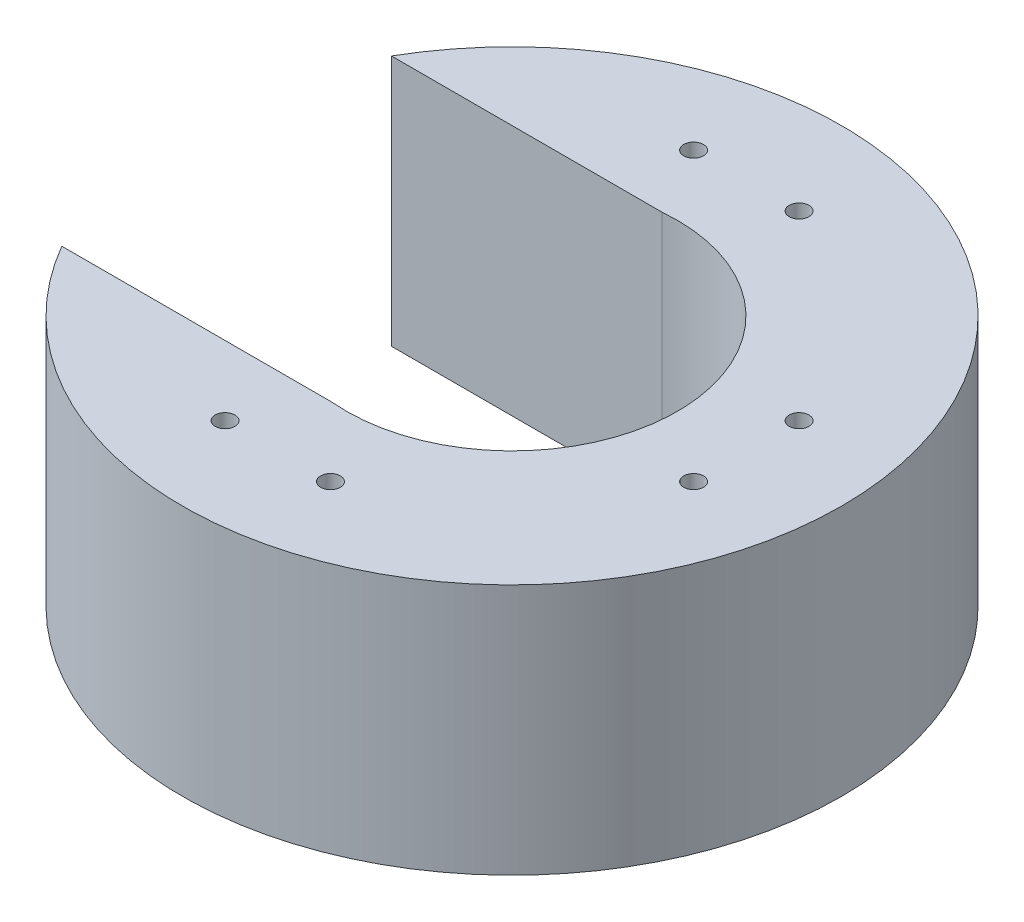
ISO-10303-21;
HEADER;
FILE_DESCRIPTION(('STEP AP214'),'2;1');
FILE_NAME('part.step','',(''),(''),'','','');
FILE_SCHEMA(('AUTOMOTIVE_DESIGN { 1 0 10303 214 1 1 1 1 }'));
ENDSEC;
DATA;
#1=APPLICATION_CONTEXT('core data for automotive mechanical design processes');
#2=APPLICATION_PROTOCOL_DEFINITION('international standard','automotive_design',2000,#1);
#3=PRODUCT_CONTEXT('',#1,'mechanical');
#4=PRODUCT('Part','Part','',(#3));
#5=PRODUCT_RELATED_PRODUCT_CATEGORY('part','',(#4));
#6=PRODUCT_DEFINITION_FORMATION('','',#4);
#7=PRODUCT_DEFINITION_CONTEXT('part definition',#1,'design');
#8=PRODUCT_DEFINITION('design','',#6,#7);
#9=PRODUCT_DEFINITION_SHAPE('','',#8);
#10=(LENGTH_UNIT() NAMED_UNIT(*) SI_UNIT(.MILLI.,.METRE.));
#11=(NAMED_UNIT(*) PLANE_ANGLE_UNIT() SI_UNIT($,.RADIAN.));
#12=(NAMED_UNIT(*) SI_UNIT($,.STERADIAN.) SOLID_ANGLE_UNIT());
#13=UNCERTAINTY_MEASURE_WITH_UNIT(LENGTH_MEASURE(1.E-05),#10,'distance_accuracy_value','');
#14=(GEOMETRIC_REPRESENTATION_CONTEXT(3) GLOBAL_UNCERTAINTY_ASSIGNED_CONTEXT((#13)) GLOBAL_UNIT_ASSIGNED_CONTEXT((#10,
#11,#12)) REPRESENTATION_CONTEXT('',''));
#15=CARTESIAN_POINT('',(0.,0.,0.));
#16=DIRECTION('',(0.,0.,1.));
#17=DIRECTION('',(1.,0.,0.));
#18=AXIS2_PLACEMENT_3D('',#15,#16,#17);
#19=CARTESIAN_POINT('',(0.,38.15,0.));
#20=DIRECTION('',(0.,1.,0.));
#21=DIRECTION('',(0.,0.,1.));
#22=AXIS2_PLACEMENT_3D('',#19,#20,#21);
#23=PLANE('',#22);
#24=DIRECTION('',(-1.,0.,0.));
#25=VECTOR('',#24,1.);
#26=CARTESIAN_POINT('',(1.70000000000003,38.15,-25.0021999032085));
#27=LINE('',#26,#25);
#28=CARTESIAN_POINT('',(-2.21359436211762,38.15,-25.0021999032085));
#29=VERTEX_POINT('',#28);
#30=CARTESIAN_POINT('',(-43.3,38.15,-25.0021999032086));
#31=VERTEX_POINT('',#30);
#32=EDGE_CURVE('E54',#29,#31,#27,.T.);
#33=ORIENTED_EDGE('',*,*,#32,.F.);
#34=CARTESIAN_POINT('',(0.,38.15,0.));
#35=DIRECTION('',(0.,-1.,0.));
#36=DIRECTION('',(0.,0.,1.));
#37=AXIS2_PLACEMENT_3D('',#34,#35,#36);
#38=CIRCLE('',#37,25.1);
#39=CARTESIAN_POINT('',(-2.21359436211755,38.15,25.0021999032085));
#40=VERTEX_POINT('',#39);
#41=EDGE_CURVE('E94',#29,#40,#38,.T.);
#42=ORIENTED_EDGE('',*,*,#41,.T.);
#43=DIRECTION('',(-1.,0.,0.));
#44=VECTOR('',#43,1.);
#45=CARTESIAN_POINT('',(1.7,38.15,25.0021999032085));
#46=LINE('',#45,#44);
#47=CARTESIAN_POINT('',(-43.3,38.15,25.0021999032085));
#48=VERTEX_POINT('',#47);
#49=EDGE_CURVE('E141',#40,#48,#46,.T.);
#50=ORIENTED_EDGE('',*,*,#49,.T.);
#51=CARTESIAN_POINT('',(0.,38.15,0.));
#52=DIRECTION('',(0.,1.,0.));
#53=DIRECTION('',(0.,0.,1.));
#54=AXIS2_PLACEMENT_3D('',#51,#52,#53);
#55=CIRCLE('',#54,50.);
#56=EDGE_CURVE('E81',#48,#31,#55,.T.);
#57=ORIENTED_EDGE('',*,*,#56,.T.);
#58=EDGE_LOOP('',(#33,#42,#50,#57));
#59=FACE_BOUND('',#58,.T.);
#60=CARTESIAN_POINT('',(35.55,38.15,-8.));
#61=DIRECTION('',(0.,1.,0.));
#62=DIRECTION('',(0.,0.,1.));
#63=AXIS2_PLACEMENT_3D('',#60,#61,#62);
#64=CIRCLE('',#63,1.5);
#65=CARTESIAN_POINT('',(35.55,38.15,-6.5));
#66=VERTEX_POINT('',#65);
#67=EDGE_CURVE('E123',#66,#66,#64,.T.);
#68=ORIENTED_EDGE('',*,*,#67,.F.);
#69=EDGE_LOOP('',(#68));
#70=FACE_BOUND('',#69,.T.);
#71=CARTESIAN_POINT('',(8.00000000000001,38.15,-35.55));
#72=DIRECTION('',(0.,1.,0.));
#73=DIRECTION('',(0.,0.,-1.));
#74=AXIS2_PLACEMENT_3D('',#71,#72,#73);
#75=CIRCLE('',#74,1.5);
#76=CARTESIAN_POINT('',(8.00000000000001,38.15,-37.05));
#77=VERTEX_POINT('',#76);
#78=EDGE_CURVE('E111',#77,#77,#75,.T.);
#79=ORIENTED_EDGE('',*,*,#78,.F.);
#80=EDGE_LOOP('',(#79));
#81=FACE_BOUND('',#80,.T.);
#82=CARTESIAN_POINT('',(8.00000000000001,38.15,35.55));
#83=DIRECTION('',(0.,1.,0.));
#84=DIRECTION('',(0.,0.,1.));
#85=AXIS2_PLACEMENT_3D('',#82,#83,#84);
#86=CIRCLE('',#85,1.5);
#87=CARTESIAN_POINT('',(8.00000000000001,38.15,37.05));
#88=VERTEX_POINT('',#87);
#89=EDGE_CURVE('E98',#88,#88,#86,.T.);
#90=ORIENTED_EDGE('',*,*,#89,.F.);
#91=EDGE_LOOP('',(#90));
#92=FACE_BOUND('',#91,.T.);
#93=CARTESIAN_POINT('',(-7.99999999999999,38.15,35.55));
#94=DIRECTION('',(0.,1.,0.));
#95=DIRECTION('',(0.,0.,-1.));
#96=AXIS2_PLACEMENT_3D('',#93,#94,#95);
#97=CIRCLE('',#96,1.50000000000001);
#98=CARTESIAN_POINT('',(-7.99999999999999,38.15,34.05));
#99=VERTEX_POINT('',#98);
#100=EDGE_CURVE('E105',#99,#99,#97,.T.);
#101=ORIENTED_EDGE('',*,*,#100,.F.);
#102=EDGE_LOOP('',(#101));
#103=FACE_BOUND('',#102,.T.);
#104=CARTESIAN_POINT('',(-7.99999999999999,38.15,-35.55));
#105=DIRECTION('',(0.,1.,0.));
#106=DIRECTION('',(0.,0.,1.));
#107=AXIS2_PLACEMENT_3D('',#104,#105,#106);
#108=CIRCLE('',#107,1.50000000000001);
#109=CARTESIAN_POINT('',(-7.99999999999999,38.15,-34.05));
#110=VERTEX_POINT('',#109);
#111=EDGE_CURVE('E117',#110,#110,#108,.T.);
#112=ORIENTED_EDGE('',*,*,#111,.F.);
#113=EDGE_LOOP('',(#112));
#114=FACE_BOUND('',#113,.T.);
#115=CARTESIAN_POINT('',(35.55,38.15,8.));
#116=DIRECTION('',(0.,1.,0.));
#117=DIRECTION('',(0.,0.,-1.));
#118=AXIS2_PLACEMENT_3D('',#115,#116,#117);
#119=CIRCLE('',#118,1.5);
#120=CARTESIAN_POINT('',(35.55,38.15,6.5));
#121=VERTEX_POINT('',#120);
#122=EDGE_CURVE('E129',#121,#121,#119,.T.);
#123=ORIENTED_EDGE('',*,*,#122,.F.);
#124=EDGE_LOOP('',(#123));
#125=FACE_BOUND('',#124,.T.);
#126=ADVANCED_FACE('F39',(#59,#70,#81,#92,#103,#114,#125),#23,.T.);
#127=CARTESIAN_POINT('',(0.,0.,0.));
#128=DIRECTION('',(0.,1.,0.));
#129=DIRECTION('',(0.,0.,1.));
#130=AXIS2_PLACEMENT_3D('',#127,#128,#129);
#131=PLANE('',#130);
#132=CARTESIAN_POINT('',(0.,0.,0.));
#133=DIRECTION('',(0.,-1.,0.));
#134=DIRECTION('',(0.,0.,1.));
#135=AXIS2_PLACEMENT_3D('',#132,#133,#134);
#136=CIRCLE('',#135,25.1);
#137=CARTESIAN_POINT('',(-2.21359436211762,0.,-25.0021999032085));
#138=VERTEX_POINT('',#137);
#139=CARTESIAN_POINT('',(-2.21359436211755,0.,25.0021999032085));
#140=VERTEX_POINT('',#139);
#141=EDGE_CURVE('E90',#138,#140,#136,.T.);
#142=ORIENTED_EDGE('',*,*,#141,.F.);
#143=DIRECTION('',(-1.,0.,0.));
#144=VECTOR('',#143,1.);
#145=CARTESIAN_POINT('',(1.70000000000003,0.,-25.0021999032085));
#146=LINE('',#145,#144);
#147=CARTESIAN_POINT('',(-43.3,0.,-25.0021999032086));
#148=VERTEX_POINT('',#147);
#149=EDGE_CURVE('E76',#138,#148,#146,.T.);
#150=ORIENTED_EDGE('',*,*,#149,.T.);
#151=CARTESIAN_POINT('',(0.,0.,0.));
#152=DIRECTION('',(0.,1.,0.));
#153=DIRECTION('',(0.,0.,1.));
#154=AXIS2_PLACEMENT_3D('',#151,#152,#153);
#155=CIRCLE('',#154,50.);
#156=CARTESIAN_POINT('',(-43.3,0.,25.0021999032085));
#157=VERTEX_POINT('',#156);
#158=EDGE_CURVE('E88',#157,#148,#155,.T.);
#159=ORIENTED_EDGE('',*,*,#158,.F.);
#160=DIRECTION('',(-1.,0.,0.));
#161=VECTOR('',#160,1.);
#162=CARTESIAN_POINT('',(1.7,0.,25.0021999032085));
#163=LINE('',#162,#161);
#164=EDGE_CURVE('E144',#140,#157,#163,.T.);
#165=ORIENTED_EDGE('',*,*,#164,.F.);
#166=EDGE_LOOP('',(#142,#150,#159,#165));
#167=FACE_BOUND('',#166,.T.);
#168=CARTESIAN_POINT('',(8.00000000000001,0.,35.55));
#169=DIRECTION('',(0.,1.,0.));
#170=DIRECTION('',(0.,0.,1.));
#171=AXIS2_PLACEMENT_3D('',#168,#169,#170);
#172=CIRCLE('',#171,1.5);
#173=CARTESIAN_POINT('',(8.00000000000001,0.,37.05));
#174=VERTEX_POINT('',#173);
#175=EDGE_CURVE('E102',#174,#174,#172,.T.);
#176=ORIENTED_EDGE('',*,*,#175,.T.);
#177=EDGE_LOOP('',(#176));
#178=FACE_BOUND('',#177,.T.);
#179=CARTESIAN_POINT('',(-7.99999999999999,0.,35.55));
#180=DIRECTION('',(0.,1.,0.));
#181=DIRECTION('',(0.,0.,-1.));
#182=AXIS2_PLACEMENT_3D('',#179,#180,#181);
#183=CIRCLE('',#182,1.50000000000001);
#184=CARTESIAN_POINT('',(-7.99999999999999,0.,34.05));
#185=VERTEX_POINT('',#184);
#186=EDGE_CURVE('E108',#185,#185,#183,.T.);
#187=ORIENTED_EDGE('',*,*,#186,.T.);
#188=EDGE_LOOP('',(#187));
#189=FACE_BOUND('',#188,.T.);
#190=CARTESIAN_POINT('',(8.00000000000001,0.,-35.55));
#191=DIRECTION('',(0.,1.,0.));
#192=DIRECTION('',(0.,0.,-1.));
#193=AXIS2_PLACEMENT_3D('',#190,#191,#192);
#194=CIRCLE('',#193,1.5);
#195=CARTESIAN_POINT('',(8.00000000000001,0.,-37.05));
#196=VERTEX_POINT('',#195);
#197=EDGE_CURVE('E114',#196,#196,#194,.T.);
#198=ORIENTED_EDGE('',*,*,#197,.T.);
#199=EDGE_LOOP('',(#198));
#200=FACE_BOUND('',#199,.T.);
#201=CARTESIAN_POINT('',(-7.99999999999999,0.,-35.55));
#202=DIRECTION('',(0.,1.,0.));
#203=DIRECTION('',(0.,0.,1.));
#204=AXIS2_PLACEMENT_3D('',#201,#202,#203);
#205=CIRCLE('',#204,1.50000000000001);
#206=CARTESIAN_POINT('',(-7.99999999999999,0.,-34.05));
#207=VERTEX_POINT('',#206);
#208=EDGE_CURVE('E120',#207,#207,#205,.T.);
#209=ORIENTED_EDGE('',*,*,#208,.T.);
#210=EDGE_LOOP('',(#209));
#211=FACE_BOUND('',#210,.T.);
#212=CARTESIAN_POINT('',(35.55,0.,-8.));
#213=DIRECTION('',(0.,1.,0.));
#214=DIRECTION('',(0.,0.,1.));
#215=AXIS2_PLACEMENT_3D('',#212,#213,#214);
#216=CIRCLE('',#215,1.5);
#217=CARTESIAN_POINT('',(35.55,0.,-6.5));
#218=VERTEX_POINT('',#217);
#219=EDGE_CURVE('E126',#218,#218,#216,.T.);
#220=ORIENTED_EDGE('',*,*,#219,.T.);
#221=EDGE_LOOP('',(#220));
#222=FACE_BOUND('',#221,.T.);
#223=CARTESIAN_POINT('',(35.55,0.,8.));
#224=DIRECTION('',(0.,1.,0.));
#225=DIRECTION('',(0.,0.,-1.));
#226=AXIS2_PLACEMENT_3D('',#223,#224,#225);
#227=CIRCLE('',#226,1.5);
#228=CARTESIAN_POINT('',(35.55,0.,6.5));
#229=VERTEX_POINT('',#228);
#230=EDGE_CURVE('E132',#229,#229,#227,.T.);
#231=ORIENTED_EDGE('',*,*,#230,.T.);
#232=EDGE_LOOP('',(#231));
#233=FACE_BOUND('',#232,.T.);
#234=ADVANCED_FACE('F85',(#167,#178,#189,#200,#211,#222,#233),#131,.F.);
#235=CARTESIAN_POINT('',(0.,38.15,0.));
#236=DIRECTION('',(0.,-1.,0.));
#237=DIRECTION('',(0.,0.,-1.));
#238=AXIS2_PLACEMENT_3D('',#235,#236,#237);
#239=CYLINDRICAL_SURFACE('',#238,25.1);
#240=ORIENTED_EDGE('',*,*,#41,.F.);
#241=DIRECTION('',(0.,-1.,0.));
#242=VECTOR('',#241,1.);
#243=CARTESIAN_POINT('',(-2.21359436211762,38.15,-25.0021999032085));
#244=LINE('',#243,#242);
#245=EDGE_CURVE('E91',#29,#138,#244,.T.);
#246=ORIENTED_EDGE('',*,*,#245,.T.);
#247=ORIENTED_EDGE('',*,*,#141,.T.);
#248=DIRECTION('',(0.,-1.,0.));
#249=VECTOR('',#248,1.);
#250=CARTESIAN_POINT('',(-2.21359436211755,38.15,25.0021999032085));
#251=LINE('',#250,#249);
#252=EDGE_CURVE('E135',#140,#40,#251,.F.);
#253=ORIENTED_EDGE('',*,*,#252,.T.);
#254=EDGE_LOOP('',(#240,#246,#247,#253));
#255=FACE_BOUND('',#254,.T.);
#256=ADVANCED_FACE('F41',(#255),#239,.F.);
#257=CARTESIAN_POINT('',(0.,38.15,0.));
#258=DIRECTION('',(0.,-1.,0.));
#259=DIRECTION('',(0.,0.,-1.));
#260=AXIS2_PLACEMENT_3D('',#257,#258,#259);
#261=CYLINDRICAL_SURFACE('',#260,50.);
#262=ORIENTED_EDGE('',*,*,#158,.T.);
#263=DIRECTION('',(0.,-1.,0.));
#264=VECTOR('',#263,1.);
#265=CARTESIAN_POINT('',(-43.3,38.15,-25.0021999032086));
#266=LINE('',#265,#264);
#267=EDGE_CURVE('E48',#31,#148,#266,.T.);
#268=ORIENTED_EDGE('',*,*,#267,.F.);
#269=ORIENTED_EDGE('',*,*,#56,.F.);
#270=DIRECTION('',(0.,-1.,0.));
#271=VECTOR('',#270,1.);
#272=CARTESIAN_POINT('',(-43.3,38.15,25.0021999032085));
#273=LINE('',#272,#271);
#274=EDGE_CURVE('E11',#48,#157,#273,.T.);
#275=ORIENTED_EDGE('',*,*,#274,.T.);
#276=EDGE_LOOP('',(#262,#268,#269,#275));
#277=FACE_BOUND('',#276,.T.);
#278=ADVANCED_FACE('F93',(#277),#261,.T.);
#279=CARTESIAN_POINT('',(8.00000000000001,38.15,35.55));
#280=DIRECTION('',(0.,-1.,0.));
#281=DIRECTION('',(0.,0.,-1.));
#282=AXIS2_PLACEMENT_3D('',#279,#280,#281);
#283=CYLINDRICAL_SURFACE('',#282,1.5);
#284=ORIENTED_EDGE('',*,*,#89,.T.);
#285=EDGE_LOOP('',(#284));
#286=FACE_BOUND('',#285,.T.);
#287=ORIENTED_EDGE('',*,*,#175,.F.);
#288=EDGE_LOOP('',(#287));
#289=FACE_BOUND('',#288,.T.);
#290=ADVANCED_FACE('F180',(#286,#289),#283,.F.);
#291=CARTESIAN_POINT('',(-7.99999999999999,38.15,35.55));
#292=DIRECTION('',(0.,-1.,0.));
#293=DIRECTION('',(0.,0.,-1.));
#294=AXIS2_PLACEMENT_3D('',#291,#292,#293);
#295=CYLINDRICAL_SURFACE('',#294,1.50000000000001);
#296=ORIENTED_EDGE('',*,*,#100,.T.);
#297=EDGE_LOOP('',(#296));
#298=FACE_BOUND('',#297,.T.);
#299=ORIENTED_EDGE('',*,*,#186,.F.);
#300=EDGE_LOOP('',(#299));
#301=FACE_BOUND('',#300,.T.);
#302=ADVANCED_FACE('F185',(#298,#301),#295,.F.);
#303=CARTESIAN_POINT('',(8.00000000000001,38.15,-35.55));
#304=DIRECTION('',(0.,-1.,0.));
#305=DIRECTION('',(0.,0.,-1.));
#306=AXIS2_PLACEMENT_3D('',#303,#304,#305);
#307=CYLINDRICAL_SURFACE('',#306,1.5);
#308=ORIENTED_EDGE('',*,*,#78,.T.);
#309=EDGE_LOOP('',(#308));
#310=FACE_BOUND('',#309,.T.);
#311=ORIENTED_EDGE('',*,*,#197,.F.);
#312=EDGE_LOOP('',(#311));
#313=FACE_BOUND('',#312,.T.);
#314=ADVANCED_FACE('F190',(#310,#313),#307,.F.);
#315=CARTESIAN_POINT('',(-7.99999999999999,38.15,-35.55));
#316=DIRECTION('',(0.,-1.,0.));
#317=DIRECTION('',(0.,0.,-1.));
#318=AXIS2_PLACEMENT_3D('',#315,#316,#317);
#319=CYLINDRICAL_SURFACE('',#318,1.50000000000001);
#320=ORIENTED_EDGE('',*,*,#111,.T.);
#321=EDGE_LOOP('',(#320));
#322=FACE_BOUND('',#321,.T.);
#323=ORIENTED_EDGE('',*,*,#208,.F.);
#324=EDGE_LOOP('',(#323));
#325=FACE_BOUND('',#324,.T.);
#326=ADVANCED_FACE('F197',(#322,#325),#319,.F.);
#327=CARTESIAN_POINT('',(35.55,38.15,-8.));
#328=DIRECTION('',(0.,-1.,0.));
#329=DIRECTION('',(0.,0.,-1.));
#330=AXIS2_PLACEMENT_3D('',#327,#328,#329);
#331=CYLINDRICAL_SURFACE('',#330,1.5);
#332=ORIENTED_EDGE('',*,*,#67,.T.);
#333=EDGE_LOOP('',(#332));
#334=FACE_BOUND('',#333,.T.);
#335=ORIENTED_EDGE('',*,*,#219,.F.);
#336=EDGE_LOOP('',(#335));
#337=FACE_BOUND('',#336,.T.);
#338=ADVANCED_FACE('F169',(#334,#337),#331,.F.);
#339=CARTESIAN_POINT('',(35.55,38.15,8.));
#340=DIRECTION('',(0.,-1.,0.));
#341=DIRECTION('',(0.,0.,-1.));
#342=AXIS2_PLACEMENT_3D('',#339,#340,#341);
#343=CYLINDRICAL_SURFACE('',#342,1.5);
#344=ORIENTED_EDGE('',*,*,#122,.T.);
#345=EDGE_LOOP('',(#344));
#346=FACE_BOUND('',#345,.T.);
#347=ORIENTED_EDGE('',*,*,#230,.F.);
#348=EDGE_LOOP('',(#347));
#349=FACE_BOUND('',#348,.T.);
#350=ADVANCED_FACE('F166',(#346,#349),#343,.F.);
#351=CARTESIAN_POINT('',(1.70000000000003,38.15,-25.0021999032085));
#352=DIRECTION('',(0.,0.,-1.));
#353=DIRECTION('',(-1.,0.,0.));
#354=AXIS2_PLACEMENT_3D('',#351,#352,#353);
#355=PLANE('',#354);
#356=ORIENTED_EDGE('',*,*,#32,.T.);
#357=ORIENTED_EDGE('',*,*,#267,.T.);
#358=ORIENTED_EDGE('',*,*,#149,.F.);
#359=ORIENTED_EDGE('',*,*,#245,.F.);
#360=EDGE_LOOP('',(#356,#357,#358,#359));
#361=FACE_BOUND('',#360,.T.);
#362=ADVANCED_FACE('F75',(#361),#355,.F.);
#363=CARTESIAN_POINT('',(1.7,0.,25.0021999032085));
#364=DIRECTION('',(0.,0.,1.));
#365=DIRECTION('',(1.,0.,0.));
#366=AXIS2_PLACEMENT_3D('',#363,#364,#365);
#367=PLANE('',#366);
#368=ORIENTED_EDGE('',*,*,#164,.T.);
#369=ORIENTED_EDGE('',*,*,#274,.F.);
#370=ORIENTED_EDGE('',*,*,#49,.F.);
#371=ORIENTED_EDGE('',*,*,#252,.F.);
#372=EDGE_LOOP('',(#368,#369,#370,#371));
#373=FACE_BOUND('',#372,.T.);
#374=ADVANCED_FACE('F147',(#373),#367,.F.);
#375=CLOSED_SHELL('',(#126,#234,#256,#278,#290,#302,#314,#326,#338,#350,#362,#374));
#376=MANIFOLD_SOLID_BREP('B2',#375);
#377=ADVANCED_BREP_SHAPE_REPRESENTATION('',(#18,#376),#14);
#378=SHAPE_DEFINITION_REPRESENTATION(#9,#377);
ENDSEC;
END-ISO-10303-21;
